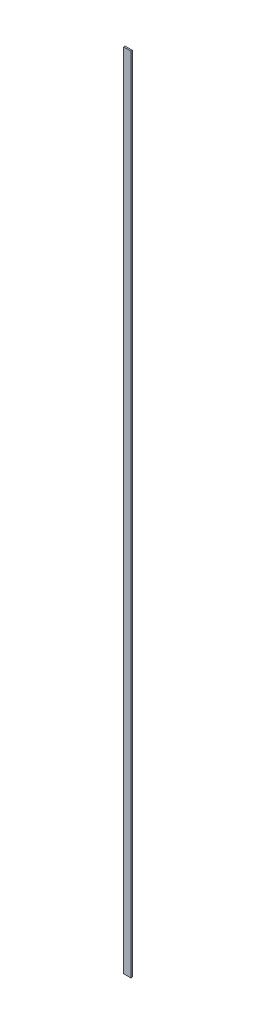
ISO-10303-21;
HEADER;
FILE_DESCRIPTION(('STEP AP214'),'2;1');
FILE_NAME('part.step','',(''),(''),'','','');
FILE_SCHEMA(('AUTOMOTIVE_DESIGN { 1 0 10303 214 1 1 1 1 }'));
ENDSEC;
DATA;
#1=APPLICATION_CONTEXT('core data for automotive mechanical design processes');
#2=APPLICATION_PROTOCOL_DEFINITION('international standard','automotive_design',2000,#1);
#3=PRODUCT_CONTEXT('',#1,'mechanical');
#4=PRODUCT('Part','Part','',(#3));
#5=PRODUCT_RELATED_PRODUCT_CATEGORY('part','',(#4));
#6=PRODUCT_DEFINITION_FORMATION('','',#4);
#7=PRODUCT_DEFINITION_CONTEXT('part definition',#1,'design');
#8=PRODUCT_DEFINITION('design','',#6,#7);
#9=PRODUCT_DEFINITION_SHAPE('','',#8);
#10=(LENGTH_UNIT() NAMED_UNIT(*) SI_UNIT(.MILLI.,.METRE.));
#11=(NAMED_UNIT(*) PLANE_ANGLE_UNIT() SI_UNIT($,.RADIAN.));
#12=(NAMED_UNIT(*) SI_UNIT($,.STERADIAN.) SOLID_ANGLE_UNIT());
#13=UNCERTAINTY_MEASURE_WITH_UNIT(LENGTH_MEASURE(1.E-05),#10,'distance_accuracy_value','');
#14=(GEOMETRIC_REPRESENTATION_CONTEXT(3) GLOBAL_UNCERTAINTY_ASSIGNED_CONTEXT((#13)) GLOBAL_UNIT_ASSIGNED_CONTEXT((#10,
#11,#12)) REPRESENTATION_CONTEXT('',''));
#15=CARTESIAN_POINT('',(0.,0.,0.));
#16=DIRECTION('',(0.,0.,1.));
#17=DIRECTION('',(1.,0.,0.));
#18=AXIS2_PLACEMENT_3D('',#15,#16,#17);
#19=CARTESIAN_POINT('',(25.,5500.,4.99999999999999));
#20=DIRECTION('',(-1.,0.,0.));
#21=DIRECTION('',(0.,0.,1.));
#22=AXIS2_PLACEMENT_3D('',#19,#20,#21);
#23=PLANE('',#22);
#24=DIRECTION('',(0.,0.,-1.));
#25=VECTOR('',#24,1.);
#26=CARTESIAN_POINT('',(25.,0.,4.99999999999999));
#27=LINE('',#26,#25);
#28=CARTESIAN_POINT('',(25.,0.,4.99999999999999));
#29=VERTEX_POINT('',#28);
#30=CARTESIAN_POINT('',(25.,0.,-5.00000000000001));
#31=VERTEX_POINT('',#30);
#32=EDGE_CURVE('E120',#29,#31,#27,.T.);
#33=ORIENTED_EDGE('',*,*,#32,.T.);
#34=DIRECTION('',(0.,-1.,0.));
#35=VECTOR('',#34,1.);
#36=CARTESIAN_POINT('',(25.,5500.,-5.00000000000001));
#37=LINE('',#36,#35);
#38=CARTESIAN_POINT('',(25.,5500.,-5.00000000000001));
#39=VERTEX_POINT('',#38);
#40=EDGE_CURVE('E12',#39,#31,#37,.T.);
#41=ORIENTED_EDGE('',*,*,#40,.F.);
#42=DIRECTION('',(0.,0.,-1.));
#43=VECTOR('',#42,1.);
#44=CARTESIAN_POINT('',(25.,5500.,4.99999999999999));
#45=LINE('',#44,#43);
#46=CARTESIAN_POINT('',(25.,5500.,4.99999999999999));
#47=VERTEX_POINT('',#46);
#48=EDGE_CURVE('E101',#47,#39,#45,.T.);
#49=ORIENTED_EDGE('',*,*,#48,.F.);
#50=DIRECTION('',(0.,-1.,0.));
#51=VECTOR('',#50,1.);
#52=CARTESIAN_POINT('',(25.,5500.,4.99999999999999));
#53=LINE('',#52,#51);
#54=EDGE_CURVE('E67',#47,#29,#53,.T.);
#55=ORIENTED_EDGE('',*,*,#54,.T.);
#56=EDGE_LOOP('',(#33,#41,#49,#55));
#57=FACE_BOUND('',#56,.T.);
#58=ADVANCED_FACE('F50',(#57),#23,.F.);
#59=CARTESIAN_POINT('',(25.,5500.,-5.00000000000001));
#60=DIRECTION('',(0.,0.,1.));
#61=DIRECTION('',(1.,0.,0.));
#62=AXIS2_PLACEMENT_3D('',#59,#60,#61);
#63=PLANE('',#62);
#64=DIRECTION('',(-1.,0.,0.));
#65=VECTOR('',#64,1.);
#66=CARTESIAN_POINT('',(25.,0.,-5.00000000000001));
#67=LINE('',#66,#65);
#68=CARTESIAN_POINT('',(-25.,0.,-5.));
#69=VERTEX_POINT('',#68);
#70=EDGE_CURVE('E107',#31,#69,#67,.T.);
#71=ORIENTED_EDGE('',*,*,#70,.T.);
#72=DIRECTION('',(0.,-1.,0.));
#73=VECTOR('',#72,1.);
#74=CARTESIAN_POINT('',(-25.,5500.,-5.));
#75=LINE('',#74,#73);
#76=CARTESIAN_POINT('',(-25.,5500.,-5.));
#77=VERTEX_POINT('',#76);
#78=EDGE_CURVE('E59',#77,#69,#75,.T.);
#79=ORIENTED_EDGE('',*,*,#78,.F.);
#80=DIRECTION('',(-1.,0.,0.));
#81=VECTOR('',#80,1.);
#82=CARTESIAN_POINT('',(25.,5500.,-5.00000000000001));
#83=LINE('',#82,#81);
#84=EDGE_CURVE('E93',#39,#77,#83,.T.);
#85=ORIENTED_EDGE('',*,*,#84,.F.);
#86=ORIENTED_EDGE('',*,*,#40,.T.);
#87=EDGE_LOOP('',(#71,#79,#85,#86));
#88=FACE_BOUND('',#87,.T.);
#89=ADVANCED_FACE('F106',(#88),#63,.F.);
#90=CARTESIAN_POINT('',(-25.,5500.,5.));
#91=DIRECTION('',(-1.,0.,0.));
#92=DIRECTION('',(0.,0.,1.));
#93=AXIS2_PLACEMENT_3D('',#90,#91,#92);
#94=PLANE('',#93);
#95=DIRECTION('',(0.,0.,-1.));
#96=VECTOR('',#95,1.);
#97=CARTESIAN_POINT('',(-25.,0.,5.));
#98=LINE('',#97,#96);
#99=CARTESIAN_POINT('',(-25.,0.,5.));
#100=VERTEX_POINT('',#99);
#101=EDGE_CURVE('E125',#100,#69,#98,.T.);
#102=ORIENTED_EDGE('',*,*,#101,.F.);
#103=DIRECTION('',(0.,-1.,0.));
#104=VECTOR('',#103,1.);
#105=CARTESIAN_POINT('',(-25.,5500.,5.));
#106=LINE('',#105,#104);
#107=CARTESIAN_POINT('',(-25.,5500.,5.));
#108=VERTEX_POINT('',#107);
#109=EDGE_CURVE('E81',#108,#100,#106,.T.);
#110=ORIENTED_EDGE('',*,*,#109,.F.);
#111=DIRECTION('',(0.,0.,-1.));
#112=VECTOR('',#111,1.);
#113=CARTESIAN_POINT('',(-25.,5500.,5.));
#114=LINE('',#113,#112);
#115=EDGE_CURVE('E100',#108,#77,#114,.T.);
#116=ORIENTED_EDGE('',*,*,#115,.T.);
#117=ORIENTED_EDGE('',*,*,#78,.T.);
#118=EDGE_LOOP('',(#102,#110,#116,#117));
#119=FACE_BOUND('',#118,.T.);
#120=ADVANCED_FACE('F111',(#119),#94,.T.);
#121=CARTESIAN_POINT('',(25.,5500.,4.99999999999999));
#122=DIRECTION('',(0.,0.,1.));
#123=DIRECTION('',(1.,0.,0.));
#124=AXIS2_PLACEMENT_3D('',#121,#122,#123);
#125=PLANE('',#124);
#126=DIRECTION('',(-1.,0.,0.));
#127=VECTOR('',#126,1.);
#128=CARTESIAN_POINT('',(25.,0.,4.99999999999999));
#129=LINE('',#128,#127);
#130=EDGE_CURVE('E128',#29,#100,#129,.T.);
#131=ORIENTED_EDGE('',*,*,#130,.F.);
#132=ORIENTED_EDGE('',*,*,#54,.F.);
#133=DIRECTION('',(-1.,0.,0.));
#134=VECTOR('',#133,1.);
#135=CARTESIAN_POINT('',(25.,5500.,4.99999999999999));
#136=LINE('',#135,#134);
#137=EDGE_CURVE('E113',#47,#108,#136,.T.);
#138=ORIENTED_EDGE('',*,*,#137,.T.);
#139=ORIENTED_EDGE('',*,*,#109,.T.);
#140=EDGE_LOOP('',(#131,#132,#138,#139));
#141=FACE_BOUND('',#140,.T.);
#142=ADVANCED_FACE('F140',(#141),#125,.T.);
#143=CARTESIAN_POINT('',(0.,5500.,0.));
#144=DIRECTION('',(0.,1.,0.));
#145=DIRECTION('',(0.,0.,1.));
#146=AXIS2_PLACEMENT_3D('',#143,#144,#145);
#147=PLANE('',#146);
#148=ORIENTED_EDGE('',*,*,#48,.T.);
#149=ORIENTED_EDGE('',*,*,#84,.T.);
#150=ORIENTED_EDGE('',*,*,#115,.F.);
#151=ORIENTED_EDGE('',*,*,#137,.F.);
#152=EDGE_LOOP('',(#148,#149,#150,#151));
#153=FACE_BOUND('',#152,.T.);
#154=ADVANCED_FACE('F97',(#153),#147,.T.);
#155=CARTESIAN_POINT('',(0.,0.,0.));
#156=DIRECTION('',(0.,1.,0.));
#157=DIRECTION('',(0.,0.,1.));
#158=AXIS2_PLACEMENT_3D('',#155,#156,#157);
#159=PLANE('',#158);
#160=ORIENTED_EDGE('',*,*,#32,.F.);
#161=ORIENTED_EDGE('',*,*,#130,.T.);
#162=ORIENTED_EDGE('',*,*,#101,.T.);
#163=ORIENTED_EDGE('',*,*,#70,.F.);
#164=EDGE_LOOP('',(#160,#161,#162,#163));
#165=FACE_BOUND('',#164,.T.);
#166=ADVANCED_FACE('F139',(#165),#159,.F.);
#167=CLOSED_SHELL('',(#58,#89,#120,#142,#154,#166));
#168=MANIFOLD_SOLID_BREP('B2',#167);
#169=ADVANCED_BREP_SHAPE_REPRESENTATION('',(#18,#168),#14);
#170=SHAPE_DEFINITION_REPRESENTATION(#9,#169);
ENDSEC;
END-ISO-10303-21;
